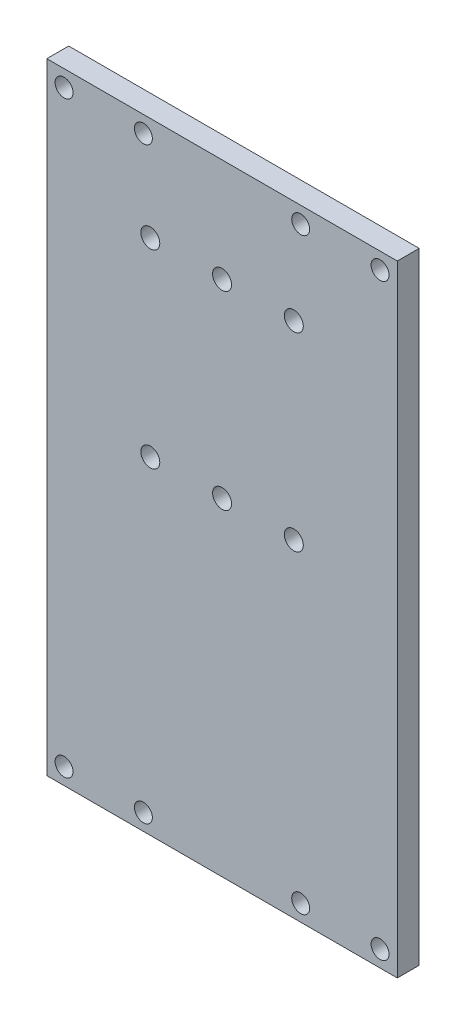
ISO-10303-21;
HEADER;
FILE_DESCRIPTION(('STEP AP214'),'2;1');
FILE_NAME('part.step','',(''),(''),'','','');
FILE_SCHEMA(('AUTOMOTIVE_DESIGN { 1 0 10303 214 1 1 1 1 }'));
ENDSEC;
DATA;
#1=APPLICATION_CONTEXT('core data for automotive mechanical design processes');
#2=APPLICATION_PROTOCOL_DEFINITION('international standard','automotive_design',2000,#1);
#3=PRODUCT_CONTEXT('',#1,'mechanical');
#4=PRODUCT('Part','Part','',(#3));
#5=PRODUCT_RELATED_PRODUCT_CATEGORY('part','',(#4));
#6=PRODUCT_DEFINITION_FORMATION('','',#4);
#7=PRODUCT_DEFINITION_CONTEXT('part definition',#1,'design');
#8=PRODUCT_DEFINITION('design','',#6,#7);
#9=PRODUCT_DEFINITION_SHAPE('','',#8);
#10=(LENGTH_UNIT() NAMED_UNIT(*) SI_UNIT(.MILLI.,.METRE.));
#11=(NAMED_UNIT(*) PLANE_ANGLE_UNIT() SI_UNIT($,.RADIAN.));
#12=(NAMED_UNIT(*) SI_UNIT($,.STERADIAN.) SOLID_ANGLE_UNIT());
#13=UNCERTAINTY_MEASURE_WITH_UNIT(LENGTH_MEASURE(1.E-05),#10,'distance_accuracy_value','');
#14=(GEOMETRIC_REPRESENTATION_CONTEXT(3) GLOBAL_UNCERTAINTY_ASSIGNED_CONTEXT((#13)) GLOBAL_UNIT_ASSIGNED_CONTEXT((#10,
#11,#12)) REPRESENTATION_CONTEXT('',''));
#15=CARTESIAN_POINT('',(0.,0.,0.));
#16=DIRECTION('',(0.,0.,1.));
#17=DIRECTION('',(1.,0.,0.));
#18=AXIS2_PLACEMENT_3D('',#15,#16,#17);
#19=CARTESIAN_POINT('',(-50.8,90.,6.35));
#20=DIRECTION('',(1.,0.,0.));
#21=DIRECTION('',(0.,1.,0.));
#22=AXIS2_PLACEMENT_3D('',#19,#20,#21);
#23=PLANE('',#22);
#24=DIRECTION('',(0.,-1.,0.));
#25=VECTOR('',#24,1.);
#26=CARTESIAN_POINT('',(-50.8,90.,0.));
#27=LINE('',#26,#25);
#28=CARTESIAN_POINT('',(-50.8,90.,0.));
#29=VERTEX_POINT('',#28);
#30=CARTESIAN_POINT('',(-50.8,-90.,0.));
#31=VERTEX_POINT('',#30);
#32=EDGE_CURVE('E94',#29,#31,#27,.T.);
#33=ORIENTED_EDGE('',*,*,#32,.T.);
#34=DIRECTION('',(0.,0.,-1.));
#35=VECTOR('',#34,1.);
#36=CARTESIAN_POINT('',(-50.8,-90.,6.35));
#37=LINE('',#36,#35);
#38=CARTESIAN_POINT('',(-50.8,-90.,6.35));
#39=VERTEX_POINT('',#38);
#40=EDGE_CURVE('E11',#39,#31,#37,.T.);
#41=ORIENTED_EDGE('',*,*,#40,.F.);
#42=DIRECTION('',(0.,-1.,0.));
#43=VECTOR('',#42,1.);
#44=CARTESIAN_POINT('',(-50.8,90.,6.35));
#45=LINE('',#44,#43);
#46=CARTESIAN_POINT('',(-50.8,90.,6.35));
#47=VERTEX_POINT('',#46);
#48=EDGE_CURVE('E82',#47,#39,#45,.T.);
#49=ORIENTED_EDGE('',*,*,#48,.F.);
#50=DIRECTION('',(0.,0.,-1.));
#51=VECTOR('',#50,1.);
#52=CARTESIAN_POINT('',(-50.8,90.,6.35));
#53=LINE('',#52,#51);
#54=EDGE_CURVE('E90',#47,#29,#53,.T.);
#55=ORIENTED_EDGE('',*,*,#54,.T.);
#56=EDGE_LOOP('',(#33,#41,#49,#55));
#57=FACE_BOUND('',#56,.T.);
#58=ADVANCED_FACE('F31',(#57),#23,.F.);
#59=CARTESIAN_POINT('',(-50.8,-90.,6.35));
#60=DIRECTION('',(0.,1.,0.));
#61=DIRECTION('',(0.,0.,1.));
#62=AXIS2_PLACEMENT_3D('',#59,#60,#61);
#63=PLANE('',#62);
#64=DIRECTION('',(1.,0.,0.));
#65=VECTOR('',#64,1.);
#66=CARTESIAN_POINT('',(-50.8,-90.,0.));
#67=LINE('',#66,#65);
#68=CARTESIAN_POINT('',(50.8,-90.,0.));
#69=VERTEX_POINT('',#68);
#70=EDGE_CURVE('E86',#31,#69,#67,.T.);
#71=ORIENTED_EDGE('',*,*,#70,.T.);
#72=DIRECTION('',(0.,0.,-1.));
#73=VECTOR('',#72,1.);
#74=CARTESIAN_POINT('',(50.8,-90.,6.35));
#75=LINE('',#74,#73);
#76=CARTESIAN_POINT('',(50.8,-90.,6.35));
#77=VERTEX_POINT('',#76);
#78=EDGE_CURVE('E39',#77,#69,#75,.T.);
#79=ORIENTED_EDGE('',*,*,#78,.F.);
#80=DIRECTION('',(1.,0.,0.));
#81=VECTOR('',#80,1.);
#82=CARTESIAN_POINT('',(-50.8,-90.,6.35));
#83=LINE('',#82,#81);
#84=EDGE_CURVE('E77',#39,#77,#83,.T.);
#85=ORIENTED_EDGE('',*,*,#84,.F.);
#86=ORIENTED_EDGE('',*,*,#40,.T.);
#87=EDGE_LOOP('',(#71,#79,#85,#86));
#88=FACE_BOUND('',#87,.T.);
#89=ADVANCED_FACE('F85',(#88),#63,.F.);
#90=CARTESIAN_POINT('',(50.8,90.,6.35));
#91=DIRECTION('',(-1.,0.,0.));
#92=DIRECTION('',(0.,-1.,0.));
#93=AXIS2_PLACEMENT_3D('',#90,#91,#92);
#94=PLANE('',#93);
#95=DIRECTION('',(0.,1.,0.));
#96=VECTOR('',#95,1.);
#97=CARTESIAN_POINT('',(50.8,90.,0.));
#98=LINE('',#97,#96);
#99=CARTESIAN_POINT('',(50.8,90.,0.));
#100=VERTEX_POINT('',#99);
#101=EDGE_CURVE('E64',#69,#100,#98,.T.);
#102=ORIENTED_EDGE('',*,*,#101,.T.);
#103=DIRECTION('',(0.,0.,-1.));
#104=VECTOR('',#103,1.);
#105=CARTESIAN_POINT('',(50.8,90.,6.35));
#106=LINE('',#105,#104);
#107=CARTESIAN_POINT('',(50.8,90.,6.35));
#108=VERTEX_POINT('',#107);
#109=EDGE_CURVE('E87',#108,#100,#106,.T.);
#110=ORIENTED_EDGE('',*,*,#109,.F.);
#111=DIRECTION('',(0.,1.,0.));
#112=VECTOR('',#111,1.);
#113=CARTESIAN_POINT('',(50.8,90.,6.35));
#114=LINE('',#113,#112);
#115=EDGE_CURVE('E80',#77,#108,#114,.T.);
#116=ORIENTED_EDGE('',*,*,#115,.F.);
#117=ORIENTED_EDGE('',*,*,#78,.T.);
#118=EDGE_LOOP('',(#102,#110,#116,#117));
#119=FACE_BOUND('',#118,.T.);
#120=ADVANCED_FACE('F88',(#119),#94,.F.);
#121=CARTESIAN_POINT('',(-50.8,90.,6.35));
#122=DIRECTION('',(0.,-1.,0.));
#123=DIRECTION('',(0.,0.,-1.));
#124=AXIS2_PLACEMENT_3D('',#121,#122,#123);
#125=PLANE('',#124);
#126=DIRECTION('',(-1.,0.,0.));
#127=VECTOR('',#126,1.);
#128=CARTESIAN_POINT('',(-50.8,90.,0.));
#129=LINE('',#128,#127);
#130=EDGE_CURVE('E70',#100,#29,#129,.T.);
#131=ORIENTED_EDGE('',*,*,#130,.T.);
#132=ORIENTED_EDGE('',*,*,#54,.F.);
#133=DIRECTION('',(-1.,0.,0.));
#134=VECTOR('',#133,1.);
#135=CARTESIAN_POINT('',(-50.8,90.,6.35));
#136=LINE('',#135,#134);
#137=EDGE_CURVE('E47',#108,#47,#136,.T.);
#138=ORIENTED_EDGE('',*,*,#137,.F.);
#139=ORIENTED_EDGE('',*,*,#109,.T.);
#140=EDGE_LOOP('',(#131,#132,#138,#139));
#141=FACE_BOUND('',#140,.T.);
#142=ADVANCED_FACE('F102',(#141),#125,.F.);
#143=CARTESIAN_POINT('',(-50.8,-90.,6.35));
#144=DIRECTION('',(0.,0.,1.));
#145=DIRECTION('',(1.,0.,0.));
#146=AXIS2_PLACEMENT_3D('',#143,#144,#145);
#147=PLANE('',#146);
#148=CARTESIAN_POINT('',(-20.8,60.,6.35));
#149=DIRECTION('',(0.,0.,1.));
#150=DIRECTION('',(-1.,0.,0.));
#151=AXIS2_PLACEMENT_3D('',#148,#149,#150);
#152=CIRCLE('',#151,2.75);
#153=CARTESIAN_POINT('',(-23.55,60.,6.35));
#154=VERTEX_POINT('',#153);
#155=EDGE_CURVE('E188',#154,#154,#152,.T.);
#156=ORIENTED_EDGE('',*,*,#155,.F.);
#157=EDGE_LOOP('',(#156));
#158=FACE_BOUND('',#157,.T.);
#159=CARTESIAN_POINT('',(0.,60.,6.35));
#160=DIRECTION('',(0.,0.,1.));
#161=DIRECTION('',(-1.,0.,0.));
#162=AXIS2_PLACEMENT_3D('',#159,#160,#161);
#163=CIRCLE('',#162,2.75);
#164=CARTESIAN_POINT('',(-2.74999999999999,60.,6.35));
#165=VERTEX_POINT('',#164);
#166=EDGE_CURVE('E182',#165,#165,#163,.T.);
#167=ORIENTED_EDGE('',*,*,#166,.F.);
#168=EDGE_LOOP('',(#167));
#169=FACE_BOUND('',#168,.T.);
#170=CARTESIAN_POINT('',(20.8,60.,6.35));
#171=DIRECTION('',(0.,0.,1.));
#172=DIRECTION('',(1.,0.,0.));
#173=AXIS2_PLACEMENT_3D('',#170,#171,#172);
#174=CIRCLE('',#173,2.74999999999999);
#175=CARTESIAN_POINT('',(23.55,60.,6.35));
#176=VERTEX_POINT('',#175);
#177=EDGE_CURVE('E176',#176,#176,#174,.T.);
#178=ORIENTED_EDGE('',*,*,#177,.F.);
#179=EDGE_LOOP('',(#178));
#180=FACE_BOUND('',#179,.T.);
#181=CARTESIAN_POINT('',(20.8,5.,6.35));
#182=DIRECTION('',(0.,0.,1.));
#183=DIRECTION('',(-1.,0.,0.));
#184=AXIS2_PLACEMENT_3D('',#181,#182,#183);
#185=CIRCLE('',#184,2.75);
#186=CARTESIAN_POINT('',(18.05,5.,6.35));
#187=VERTEX_POINT('',#186);
#188=EDGE_CURVE('E170',#187,#187,#185,.T.);
#189=ORIENTED_EDGE('',*,*,#188,.F.);
#190=EDGE_LOOP('',(#189));
#191=FACE_BOUND('',#190,.T.);
#192=CARTESIAN_POINT('',(0.,5.,6.35));
#193=DIRECTION('',(0.,0.,1.));
#194=DIRECTION('',(1.,0.,0.));
#195=AXIS2_PLACEMENT_3D('',#192,#193,#194);
#196=CIRCLE('',#195,2.75);
#197=CARTESIAN_POINT('',(2.75000000000001,5.,6.35));
#198=VERTEX_POINT('',#197);
#199=EDGE_CURVE('E164',#198,#198,#196,.T.);
#200=ORIENTED_EDGE('',*,*,#199,.F.);
#201=EDGE_LOOP('',(#200));
#202=FACE_BOUND('',#201,.T.);
#203=CARTESIAN_POINT('',(-20.8,5.,6.35));
#204=DIRECTION('',(0.,0.,1.));
#205=DIRECTION('',(1.,0.,0.));
#206=AXIS2_PLACEMENT_3D('',#203,#204,#205);
#207=CIRCLE('',#206,2.75);
#208=CARTESIAN_POINT('',(-18.05,5.,6.35));
#209=VERTEX_POINT('',#208);
#210=EDGE_CURVE('E158',#209,#209,#207,.T.);
#211=ORIENTED_EDGE('',*,*,#210,.F.);
#212=EDGE_LOOP('',(#211));
#213=FACE_BOUND('',#212,.T.);
#214=CARTESIAN_POINT('',(-45.8000000000001,-85.2399999999999,6.35));
#215=DIRECTION('',(0.,0.,1.));
#216=DIRECTION('',(-1.,0.,0.));
#217=AXIS2_PLACEMENT_3D('',#214,#215,#216);
#218=CIRCLE('',#217,2.6);
#219=CARTESIAN_POINT('',(-48.4000000000001,-85.2399999999999,6.35));
#220=VERTEX_POINT('',#219);
#221=EDGE_CURVE('E152',#220,#220,#218,.T.);
#222=ORIENTED_EDGE('',*,*,#221,.F.);
#223=EDGE_LOOP('',(#222));
#224=FACE_BOUND('',#223,.T.);
#225=CARTESIAN_POINT('',(-22.8,-85.24,6.35));
#226=DIRECTION('',(0.,0.,1.));
#227=DIRECTION('',(-1.,0.,0.));
#228=AXIS2_PLACEMENT_3D('',#225,#226,#227);
#229=CIRCLE('',#228,2.60000000000001);
#230=CARTESIAN_POINT('',(-25.4,-85.24,6.35));
#231=VERTEX_POINT('',#230);
#232=EDGE_CURVE('E146',#231,#231,#229,.T.);
#233=ORIENTED_EDGE('',*,*,#232,.F.);
#234=EDGE_LOOP('',(#233));
#235=FACE_BOUND('',#234,.T.);
#236=CARTESIAN_POINT('',(22.8,-85.24,6.35));
#237=DIRECTION('',(0.,0.,1.));
#238=DIRECTION('',(1.,0.,0.));
#239=AXIS2_PLACEMENT_3D('',#236,#237,#238);
#240=CIRCLE('',#239,2.60000000000001);
#241=CARTESIAN_POINT('',(25.4,-85.24,6.35));
#242=VERTEX_POINT('',#241);
#243=EDGE_CURVE('E140',#242,#242,#240,.T.);
#244=ORIENTED_EDGE('',*,*,#243,.F.);
#245=EDGE_LOOP('',(#244));
#246=FACE_BOUND('',#245,.T.);
#247=CARTESIAN_POINT('',(45.7999999999999,-85.24,6.35));
#248=DIRECTION('',(0.,0.,1.));
#249=DIRECTION('',(1.,0.,0.));
#250=AXIS2_PLACEMENT_3D('',#247,#248,#249);
#251=CIRCLE('',#250,2.6);
#252=CARTESIAN_POINT('',(48.3999999999999,-85.24,6.35));
#253=VERTEX_POINT('',#252);
#254=EDGE_CURVE('E134',#253,#253,#251,.T.);
#255=ORIENTED_EDGE('',*,*,#254,.F.);
#256=EDGE_LOOP('',(#255));
#257=FACE_BOUND('',#256,.T.);
#258=CARTESIAN_POINT('',(45.8,85.24,6.35));
#259=DIRECTION('',(0.,0.,1.));
#260=DIRECTION('',(-1.,0.,0.));
#261=AXIS2_PLACEMENT_3D('',#258,#259,#260);
#262=CIRCLE('',#261,2.6);
#263=CARTESIAN_POINT('',(43.2,85.24,6.35));
#264=VERTEX_POINT('',#263);
#265=EDGE_CURVE('E128',#264,#264,#262,.T.);
#266=ORIENTED_EDGE('',*,*,#265,.F.);
#267=EDGE_LOOP('',(#266));
#268=FACE_BOUND('',#267,.T.);
#269=CARTESIAN_POINT('',(22.8,85.24,6.35));
#270=DIRECTION('',(0.,0.,1.));
#271=DIRECTION('',(-1.,0.,0.));
#272=AXIS2_PLACEMENT_3D('',#269,#270,#271);
#273=CIRCLE('',#272,2.60000000000001);
#274=CARTESIAN_POINT('',(20.2,85.24,6.35));
#275=VERTEX_POINT('',#274);
#276=EDGE_CURVE('E122',#275,#275,#273,.T.);
#277=ORIENTED_EDGE('',*,*,#276,.F.);
#278=EDGE_LOOP('',(#277));
#279=FACE_BOUND('',#278,.T.);
#280=CARTESIAN_POINT('',(-22.8,85.24,6.35));
#281=DIRECTION('',(0.,0.,1.));
#282=DIRECTION('',(1.,0.,0.));
#283=AXIS2_PLACEMENT_3D('',#280,#281,#282);
#284=CIRCLE('',#283,2.60000000000001);
#285=CARTESIAN_POINT('',(-20.2,85.24,6.35));
#286=VERTEX_POINT('',#285);
#287=EDGE_CURVE('E116',#286,#286,#284,.T.);
#288=ORIENTED_EDGE('',*,*,#287,.F.);
#289=EDGE_LOOP('',(#288));
#290=FACE_BOUND('',#289,.T.);
#291=CARTESIAN_POINT('',(-45.8,85.24,6.35));
#292=DIRECTION('',(0.,0.,1.));
#293=DIRECTION('',(1.,0.,0.));
#294=AXIS2_PLACEMENT_3D('',#291,#292,#293);
#295=CIRCLE('',#294,2.6);
#296=CARTESIAN_POINT('',(-43.2,85.24,6.35));
#297=VERTEX_POINT('',#296);
#298=EDGE_CURVE('E110',#297,#297,#295,.T.);
#299=ORIENTED_EDGE('',*,*,#298,.F.);
#300=EDGE_LOOP('',(#299));
#301=FACE_BOUND('',#300,.T.);
#302=ORIENTED_EDGE('',*,*,#48,.T.);
#303=ORIENTED_EDGE('',*,*,#84,.T.);
#304=ORIENTED_EDGE('',*,*,#115,.T.);
#305=ORIENTED_EDGE('',*,*,#137,.T.);
#306=EDGE_LOOP('',(#302,#303,#304,#305));
#307=FACE_BOUND('',#306,.T.);
#308=ADVANCED_FACE('F78',(#158,#169,#180,#191,#202,#213,#224,#235,#246,#257,#268,#279,#290,#301,
#307),#147,.T.);
#309=CARTESIAN_POINT('',(-50.8,-90.,0.));
#310=DIRECTION('',(0.,0.,1.));
#311=DIRECTION('',(1.,0.,0.));
#312=AXIS2_PLACEMENT_3D('',#309,#310,#311);
#313=PLANE('',#312);
#314=CARTESIAN_POINT('',(-20.8,60.,0.));
#315=DIRECTION('',(0.,0.,1.));
#316=DIRECTION('',(1.,0.,0.));
#317=AXIS2_PLACEMENT_3D('',#314,#315,#316);
#318=CIRCLE('',#317,2.75);
#319=CARTESIAN_POINT('',(-18.05,60.,0.));
#320=VERTEX_POINT('',#319);
#321=EDGE_CURVE('E185',#320,#320,#318,.F.);
#322=ORIENTED_EDGE('',*,*,#321,.F.);
#323=EDGE_LOOP('',(#322));
#324=FACE_BOUND('',#323,.T.);
#325=CARTESIAN_POINT('',(0.,60.,0.));
#326=DIRECTION('',(0.,0.,1.));
#327=DIRECTION('',(1.,0.,0.));
#328=AXIS2_PLACEMENT_3D('',#325,#326,#327);
#329=CIRCLE('',#328,2.75);
#330=CARTESIAN_POINT('',(2.75000000000001,60.,0.));
#331=VERTEX_POINT('',#330);
#332=EDGE_CURVE('E179',#331,#331,#329,.F.);
#333=ORIENTED_EDGE('',*,*,#332,.F.);
#334=EDGE_LOOP('',(#333));
#335=FACE_BOUND('',#334,.T.);
#336=CARTESIAN_POINT('',(20.8,60.,0.));
#337=DIRECTION('',(0.,0.,1.));
#338=DIRECTION('',(1.,0.,0.));
#339=AXIS2_PLACEMENT_3D('',#336,#337,#338);
#340=CIRCLE('',#339,2.74999999999999);
#341=CARTESIAN_POINT('',(23.55,60.,0.));
#342=VERTEX_POINT('',#341);
#343=EDGE_CURVE('E173',#342,#342,#340,.F.);
#344=ORIENTED_EDGE('',*,*,#343,.F.);
#345=EDGE_LOOP('',(#344));
#346=FACE_BOUND('',#345,.T.);
#347=CARTESIAN_POINT('',(20.8,5.,0.));
#348=DIRECTION('',(0.,0.,1.));
#349=DIRECTION('',(1.,0.,0.));
#350=AXIS2_PLACEMENT_3D('',#347,#348,#349);
#351=CIRCLE('',#350,2.75);
#352=CARTESIAN_POINT('',(23.55,5.,0.));
#353=VERTEX_POINT('',#352);
#354=EDGE_CURVE('E167',#353,#353,#351,.F.);
#355=ORIENTED_EDGE('',*,*,#354,.F.);
#356=EDGE_LOOP('',(#355));
#357=FACE_BOUND('',#356,.T.);
#358=CARTESIAN_POINT('',(0.,5.,0.));
#359=DIRECTION('',(0.,0.,1.));
#360=DIRECTION('',(1.,0.,0.));
#361=AXIS2_PLACEMENT_3D('',#358,#359,#360);
#362=CIRCLE('',#361,2.75);
#363=CARTESIAN_POINT('',(2.75000000000001,5.,0.));
#364=VERTEX_POINT('',#363);
#365=EDGE_CURVE('E161',#364,#364,#362,.F.);
#366=ORIENTED_EDGE('',*,*,#365,.F.);
#367=EDGE_LOOP('',(#366));
#368=FACE_BOUND('',#367,.T.);
#369=CARTESIAN_POINT('',(-20.8,5.,0.));
#370=DIRECTION('',(0.,0.,1.));
#371=DIRECTION('',(1.,0.,0.));
#372=AXIS2_PLACEMENT_3D('',#369,#370,#371);
#373=CIRCLE('',#372,2.75);
#374=CARTESIAN_POINT('',(-18.05,5.,0.));
#375=VERTEX_POINT('',#374);
#376=EDGE_CURVE('E155',#375,#375,#373,.F.);
#377=ORIENTED_EDGE('',*,*,#376,.F.);
#378=EDGE_LOOP('',(#377));
#379=FACE_BOUND('',#378,.T.);
#380=CARTESIAN_POINT('',(-45.8000000000001,-85.2399999999999,0.));
#381=DIRECTION('',(0.,0.,1.));
#382=DIRECTION('',(1.,0.,0.));
#383=AXIS2_PLACEMENT_3D('',#380,#381,#382);
#384=CIRCLE('',#383,2.6);
#385=CARTESIAN_POINT('',(-43.2000000000001,-85.2399999999999,0.));
#386=VERTEX_POINT('',#385);
#387=EDGE_CURVE('E149',#386,#386,#384,.F.);
#388=ORIENTED_EDGE('',*,*,#387,.F.);
#389=EDGE_LOOP('',(#388));
#390=FACE_BOUND('',#389,.T.);
#391=CARTESIAN_POINT('',(-22.8,-85.24,0.));
#392=DIRECTION('',(0.,0.,1.));
#393=DIRECTION('',(1.,0.,0.));
#394=AXIS2_PLACEMENT_3D('',#391,#392,#393);
#395=CIRCLE('',#394,2.60000000000001);
#396=CARTESIAN_POINT('',(-20.2,-85.24,0.));
#397=VERTEX_POINT('',#396);
#398=EDGE_CURVE('E143',#397,#397,#395,.F.);
#399=ORIENTED_EDGE('',*,*,#398,.F.);
#400=EDGE_LOOP('',(#399));
#401=FACE_BOUND('',#400,.T.);
#402=CARTESIAN_POINT('',(22.8,-85.24,0.));
#403=DIRECTION('',(0.,0.,1.));
#404=DIRECTION('',(1.,0.,0.));
#405=AXIS2_PLACEMENT_3D('',#402,#403,#404);
#406=CIRCLE('',#405,2.60000000000001);
#407=CARTESIAN_POINT('',(25.4,-85.24,0.));
#408=VERTEX_POINT('',#407);
#409=EDGE_CURVE('E137',#408,#408,#406,.F.);
#410=ORIENTED_EDGE('',*,*,#409,.F.);
#411=EDGE_LOOP('',(#410));
#412=FACE_BOUND('',#411,.T.);
#413=CARTESIAN_POINT('',(45.7999999999999,-85.24,0.));
#414=DIRECTION('',(0.,0.,1.));
#415=DIRECTION('',(1.,0.,0.));
#416=AXIS2_PLACEMENT_3D('',#413,#414,#415);
#417=CIRCLE('',#416,2.6);
#418=CARTESIAN_POINT('',(48.3999999999999,-85.24,0.));
#419=VERTEX_POINT('',#418);
#420=EDGE_CURVE('E131',#419,#419,#417,.F.);
#421=ORIENTED_EDGE('',*,*,#420,.F.);
#422=EDGE_LOOP('',(#421));
#423=FACE_BOUND('',#422,.T.);
#424=CARTESIAN_POINT('',(45.8,85.24,0.));
#425=DIRECTION('',(0.,0.,1.));
#426=DIRECTION('',(1.,0.,0.));
#427=AXIS2_PLACEMENT_3D('',#424,#425,#426);
#428=CIRCLE('',#427,2.6);
#429=CARTESIAN_POINT('',(48.4,85.24,0.));
#430=VERTEX_POINT('',#429);
#431=EDGE_CURVE('E125',#430,#430,#428,.F.);
#432=ORIENTED_EDGE('',*,*,#431,.F.);
#433=EDGE_LOOP('',(#432));
#434=FACE_BOUND('',#433,.T.);
#435=CARTESIAN_POINT('',(22.8,85.24,0.));
#436=DIRECTION('',(0.,0.,1.));
#437=DIRECTION('',(1.,0.,0.));
#438=AXIS2_PLACEMENT_3D('',#435,#436,#437);
#439=CIRCLE('',#438,2.60000000000001);
#440=CARTESIAN_POINT('',(25.4,85.24,0.));
#441=VERTEX_POINT('',#440);
#442=EDGE_CURVE('E119',#441,#441,#439,.F.);
#443=ORIENTED_EDGE('',*,*,#442,.F.);
#444=EDGE_LOOP('',(#443));
#445=FACE_BOUND('',#444,.T.);
#446=CARTESIAN_POINT('',(-22.8,85.24,0.));
#447=DIRECTION('',(0.,0.,1.));
#448=DIRECTION('',(1.,0.,0.));
#449=AXIS2_PLACEMENT_3D('',#446,#447,#448);
#450=CIRCLE('',#449,2.60000000000001);
#451=CARTESIAN_POINT('',(-20.2,85.24,0.));
#452=VERTEX_POINT('',#451);
#453=EDGE_CURVE('E113',#452,#452,#450,.F.);
#454=ORIENTED_EDGE('',*,*,#453,.F.);
#455=EDGE_LOOP('',(#454));
#456=FACE_BOUND('',#455,.T.);
#457=CARTESIAN_POINT('',(-45.8,85.24,0.));
#458=DIRECTION('',(0.,0.,1.));
#459=DIRECTION('',(1.,0.,0.));
#460=AXIS2_PLACEMENT_3D('',#457,#458,#459);
#461=CIRCLE('',#460,2.6);
#462=CARTESIAN_POINT('',(-43.2,85.24,0.));
#463=VERTEX_POINT('',#462);
#464=EDGE_CURVE('E97',#463,#463,#461,.F.);
#465=ORIENTED_EDGE('',*,*,#464,.F.);
#466=EDGE_LOOP('',(#465));
#467=FACE_BOUND('',#466,.T.);
#468=ORIENTED_EDGE('',*,*,#32,.F.);
#469=ORIENTED_EDGE('',*,*,#130,.F.);
#470=ORIENTED_EDGE('',*,*,#101,.F.);
#471=ORIENTED_EDGE('',*,*,#70,.F.);
#472=EDGE_LOOP('',(#468,#469,#470,#471));
#473=FACE_BOUND('',#472,.T.);
#474=ADVANCED_FACE('F105',(#324,#335,#346,#357,#368,#379,#390,#401,#412,#423,#434,#445,#456,
#467,#473),#313,.F.);
#475=CARTESIAN_POINT('',(-45.8,85.24,-0.00100000000000013));
#476=DIRECTION('',(0.,0.,1.));
#477=DIRECTION('',(1.,0.,0.));
#478=AXIS2_PLACEMENT_3D('',#475,#476,#477);
#479=CYLINDRICAL_SURFACE('',#478,2.6);
#480=ORIENTED_EDGE('',*,*,#298,.T.);
#481=EDGE_LOOP('',(#480));
#482=FACE_BOUND('',#481,.T.);
#483=ORIENTED_EDGE('',*,*,#464,.T.);
#484=EDGE_LOOP('',(#483));
#485=FACE_BOUND('',#484,.T.);
#486=ADVANCED_FACE('F224',(#482,#485),#479,.F.);
#487=CARTESIAN_POINT('',(-22.8,85.24,-0.00100000000000013));
#488=DIRECTION('',(0.,0.,1.));
#489=DIRECTION('',(1.,0.,0.));
#490=AXIS2_PLACEMENT_3D('',#487,#488,#489);
#491=CYLINDRICAL_SURFACE('',#490,2.60000000000001);
#492=ORIENTED_EDGE('',*,*,#287,.T.);
#493=EDGE_LOOP('',(#492));
#494=FACE_BOUND('',#493,.T.);
#495=ORIENTED_EDGE('',*,*,#453,.T.);
#496=EDGE_LOOP('',(#495));
#497=FACE_BOUND('',#496,.T.);
#498=ADVANCED_FACE('F227',(#494,#497),#491,.F.);
#499=CARTESIAN_POINT('',(22.8,85.24,-0.00100000000000013));
#500=DIRECTION('',(0.,0.,1.));
#501=DIRECTION('',(1.,0.,0.));
#502=AXIS2_PLACEMENT_3D('',#499,#500,#501);
#503=CYLINDRICAL_SURFACE('',#502,2.60000000000001);
#504=ORIENTED_EDGE('',*,*,#276,.T.);
#505=EDGE_LOOP('',(#504));
#506=FACE_BOUND('',#505,.T.);
#507=ORIENTED_EDGE('',*,*,#442,.T.);
#508=EDGE_LOOP('',(#507));
#509=FACE_BOUND('',#508,.T.);
#510=ADVANCED_FACE('F348',(#506,#509),#503,.F.);
#511=CARTESIAN_POINT('',(45.8,85.24,-0.00100000000000013));
#512=DIRECTION('',(0.,0.,1.));
#513=DIRECTION('',(1.,0.,0.));
#514=AXIS2_PLACEMENT_3D('',#511,#512,#513);
#515=CYLINDRICAL_SURFACE('',#514,2.6);
#516=ORIENTED_EDGE('',*,*,#265,.T.);
#517=EDGE_LOOP('',(#516));
#518=FACE_BOUND('',#517,.T.);
#519=ORIENTED_EDGE('',*,*,#431,.T.);
#520=EDGE_LOOP('',(#519));
#521=FACE_BOUND('',#520,.T.);
#522=ADVANCED_FACE('F344',(#518,#521),#515,.F.);
#523=CARTESIAN_POINT('',(45.7999999999999,-85.24,-0.00100000000000013));
#524=DIRECTION('',(0.,0.,1.));
#525=DIRECTION('',(1.,0.,0.));
#526=AXIS2_PLACEMENT_3D('',#523,#524,#525);
#527=CYLINDRICAL_SURFACE('',#526,2.6);
#528=ORIENTED_EDGE('',*,*,#254,.T.);
#529=EDGE_LOOP('',(#528));
#530=FACE_BOUND('',#529,.T.);
#531=ORIENTED_EDGE('',*,*,#420,.T.);
#532=EDGE_LOOP('',(#531));
#533=FACE_BOUND('',#532,.T.);
#534=ADVANCED_FACE('F340',(#530,#533),#527,.F.);
#535=CARTESIAN_POINT('',(22.8,-85.24,-0.00100000000000013));
#536=DIRECTION('',(0.,0.,1.));
#537=DIRECTION('',(1.,0.,0.));
#538=AXIS2_PLACEMENT_3D('',#535,#536,#537);
#539=CYLINDRICAL_SURFACE('',#538,2.60000000000001);
#540=ORIENTED_EDGE('',*,*,#243,.T.);
#541=EDGE_LOOP('',(#540));
#542=FACE_BOUND('',#541,.T.);
#543=ORIENTED_EDGE('',*,*,#409,.T.);
#544=EDGE_LOOP('',(#543));
#545=FACE_BOUND('',#544,.T.);
#546=ADVANCED_FACE('F336',(#542,#545),#539,.F.);
#547=CARTESIAN_POINT('',(-22.8,-85.24,-0.00100000000000013));
#548=DIRECTION('',(0.,0.,1.));
#549=DIRECTION('',(1.,0.,0.));
#550=AXIS2_PLACEMENT_3D('',#547,#548,#549);
#551=CYLINDRICAL_SURFACE('',#550,2.60000000000001);
#552=ORIENTED_EDGE('',*,*,#232,.T.);
#553=EDGE_LOOP('',(#552));
#554=FACE_BOUND('',#553,.T.);
#555=ORIENTED_EDGE('',*,*,#398,.T.);
#556=EDGE_LOOP('',(#555));
#557=FACE_BOUND('',#556,.T.);
#558=ADVANCED_FACE('F332',(#554,#557),#551,.F.);
#559=CARTESIAN_POINT('',(-45.8000000000001,-85.2399999999999,-0.00100000000000013));
#560=DIRECTION('',(0.,0.,1.));
#561=DIRECTION('',(1.,0.,0.));
#562=AXIS2_PLACEMENT_3D('',#559,#560,#561);
#563=CYLINDRICAL_SURFACE('',#562,2.6);
#564=ORIENTED_EDGE('',*,*,#221,.T.);
#565=EDGE_LOOP('',(#564));
#566=FACE_BOUND('',#565,.T.);
#567=ORIENTED_EDGE('',*,*,#387,.T.);
#568=EDGE_LOOP('',(#567));
#569=FACE_BOUND('',#568,.T.);
#570=ADVANCED_FACE('F263',(#566,#569),#563,.F.);
#571=CARTESIAN_POINT('',(-20.8,5.,-0.00100000000000013));
#572=DIRECTION('',(0.,0.,1.));
#573=DIRECTION('',(1.,0.,0.));
#574=AXIS2_PLACEMENT_3D('',#571,#572,#573);
#575=CYLINDRICAL_SURFACE('',#574,2.75);
#576=ORIENTED_EDGE('',*,*,#210,.T.);
#577=EDGE_LOOP('',(#576));
#578=FACE_BOUND('',#577,.T.);
#579=ORIENTED_EDGE('',*,*,#376,.T.);
#580=EDGE_LOOP('',(#579));
#581=FACE_BOUND('',#580,.T.);
#582=ADVANCED_FACE('F273',(#578,#581),#575,.F.);
#583=CARTESIAN_POINT('',(0.,5.,-0.00100000000000013));
#584=DIRECTION('',(0.,0.,1.));
#585=DIRECTION('',(1.,0.,0.));
#586=AXIS2_PLACEMENT_3D('',#583,#584,#585);
#587=CYLINDRICAL_SURFACE('',#586,2.75);
#588=ORIENTED_EDGE('',*,*,#199,.T.);
#589=EDGE_LOOP('',(#588));
#590=FACE_BOUND('',#589,.T.);
#591=ORIENTED_EDGE('',*,*,#365,.T.);
#592=EDGE_LOOP('',(#591));
#593=FACE_BOUND('',#592,.T.);
#594=ADVANCED_FACE('F278',(#590,#593),#587,.F.);
#595=CARTESIAN_POINT('',(20.8,5.,-0.00100000000000013));
#596=DIRECTION('',(0.,0.,1.));
#597=DIRECTION('',(1.,0.,0.));
#598=AXIS2_PLACEMENT_3D('',#595,#596,#597);
#599=CYLINDRICAL_SURFACE('',#598,2.75);
#600=ORIENTED_EDGE('',*,*,#188,.T.);
#601=EDGE_LOOP('',(#600));
#602=FACE_BOUND('',#601,.T.);
#603=ORIENTED_EDGE('',*,*,#354,.T.);
#604=EDGE_LOOP('',(#603));
#605=FACE_BOUND('',#604,.T.);
#606=ADVANCED_FACE('F288',(#602,#605),#599,.F.);
#607=CARTESIAN_POINT('',(20.8,60.,-0.00100000000000013));
#608=DIRECTION('',(0.,0.,1.));
#609=DIRECTION('',(1.,0.,0.));
#610=AXIS2_PLACEMENT_3D('',#607,#608,#609);
#611=CYLINDRICAL_SURFACE('',#610,2.74999999999999);
#612=ORIENTED_EDGE('',*,*,#177,.T.);
#613=EDGE_LOOP('',(#612));
#614=FACE_BOUND('',#613,.T.);
#615=ORIENTED_EDGE('',*,*,#343,.T.);
#616=EDGE_LOOP('',(#615));
#617=FACE_BOUND('',#616,.T.);
#618=ADVANCED_FACE('F298',(#614,#617),#611,.F.);
#619=CARTESIAN_POINT('',(0.,60.,-0.00100000000000013));
#620=DIRECTION('',(0.,0.,1.));
#621=DIRECTION('',(1.,0.,0.));
#622=AXIS2_PLACEMENT_3D('',#619,#620,#621);
#623=CYLINDRICAL_SURFACE('',#622,2.75);
#624=ORIENTED_EDGE('',*,*,#166,.T.);
#625=EDGE_LOOP('',(#624));
#626=FACE_BOUND('',#625,.T.);
#627=ORIENTED_EDGE('',*,*,#332,.T.);
#628=EDGE_LOOP('',(#627));
#629=FACE_BOUND('',#628,.T.);
#630=ADVANCED_FACE('F308',(#626,#629),#623,.F.);
#631=CARTESIAN_POINT('',(-20.8,60.,-0.00100000000000013));
#632=DIRECTION('',(0.,0.,1.));
#633=DIRECTION('',(1.,0.,0.));
#634=AXIS2_PLACEMENT_3D('',#631,#632,#633);
#635=CYLINDRICAL_SURFACE('',#634,2.75);
#636=ORIENTED_EDGE('',*,*,#155,.T.);
#637=EDGE_LOOP('',(#636));
#638=FACE_BOUND('',#637,.T.);
#639=ORIENTED_EDGE('',*,*,#321,.T.);
#640=EDGE_LOOP('',(#639));
#641=FACE_BOUND('',#640,.T.);
#642=ADVANCED_FACE('F192',(#638,#641),#635,.F.);
#643=CLOSED_SHELL('',(#58,#89,#120,#142,#308,#474,#486,#498,#510,#522,#534,#546,#558,#570,#582,
#594,#606,#618,#630,#642));
#644=MANIFOLD_SOLID_BREP('B2',#643);
#645=ADVANCED_BREP_SHAPE_REPRESENTATION('',(#18,#644),#14);
#646=SHAPE_DEFINITION_REPRESENTATION(#9,#645);
ENDSEC;
END-ISO-10303-21;
